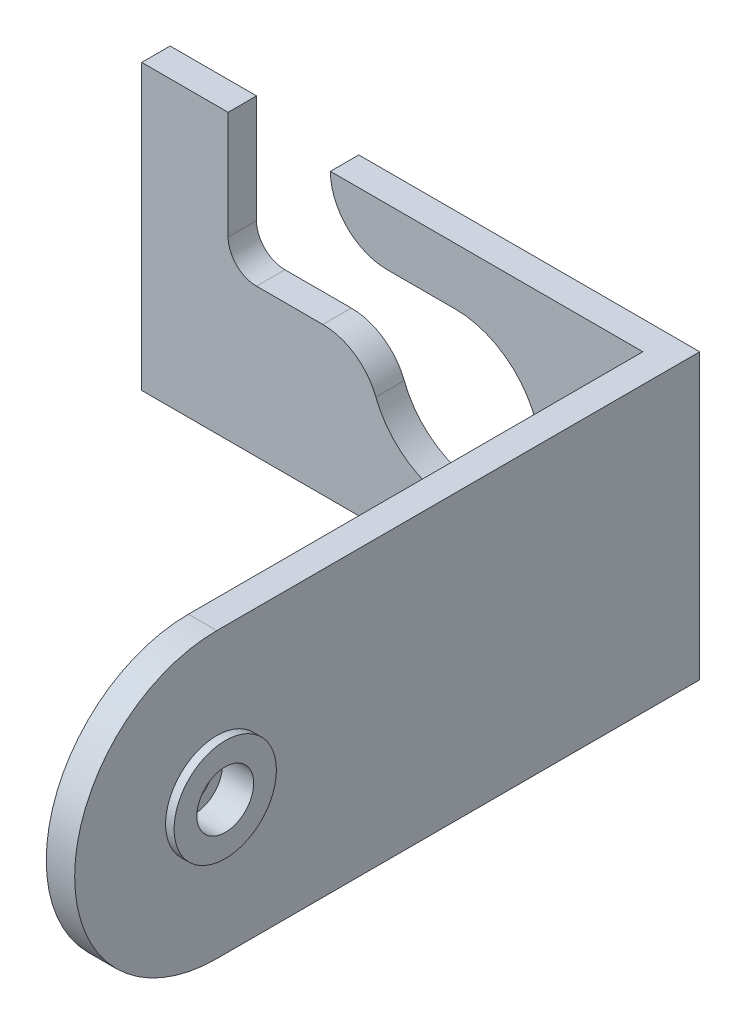
ISO-10303-21;
HEADER;
FILE_DESCRIPTION(('STEP AP214'),'2;1');
FILE_NAME('part.step','',(''),(''),'','','');
FILE_SCHEMA(('AUTOMOTIVE_DESIGN { 1 0 10303 214 1 1 1 1 }'));
ENDSEC;
DATA;
#1=APPLICATION_CONTEXT('core data for automotive mechanical design processes');
#2=APPLICATION_PROTOCOL_DEFINITION('international standard','automotive_design',2000,#1);
#3=PRODUCT_CONTEXT('',#1,'mechanical');
#4=PRODUCT('Part','Part','',(#3));
#5=PRODUCT_RELATED_PRODUCT_CATEGORY('part','',(#4));
#6=PRODUCT_DEFINITION_FORMATION('','',#4);
#7=PRODUCT_DEFINITION_CONTEXT('part definition',#1,'design');
#8=PRODUCT_DEFINITION('design','',#6,#7);
#9=PRODUCT_DEFINITION_SHAPE('','',#8);
#10=(LENGTH_UNIT() NAMED_UNIT(*) SI_UNIT(.MILLI.,.METRE.));
#11=(NAMED_UNIT(*) PLANE_ANGLE_UNIT() SI_UNIT($,.RADIAN.));
#12=(NAMED_UNIT(*) SI_UNIT($,.STERADIAN.) SOLID_ANGLE_UNIT());
#13=UNCERTAINTY_MEASURE_WITH_UNIT(LENGTH_MEASURE(1.E-05),#10,'distance_accuracy_value','');
#14=(GEOMETRIC_REPRESENTATION_CONTEXT(3) GLOBAL_UNCERTAINTY_ASSIGNED_CONTEXT((#13)) GLOBAL_UNIT_ASSIGNED_CONTEXT((#10,
#11,#12)) REPRESENTATION_CONTEXT('',''));
#15=CARTESIAN_POINT('',(0.,0.,0.));
#16=DIRECTION('',(0.,0.,1.));
#17=DIRECTION('',(1.,0.,0.));
#18=AXIS2_PLACEMENT_3D('',#15,#16,#17);
#19=CARTESIAN_POINT('',(2.5,12.5,0.));
#20=DIRECTION('',(0.,1.,0.));
#21=DIRECTION('',(0.,0.,1.));
#22=AXIS2_PLACEMENT_3D('',#19,#20,#21);
#23=PLANE('',#22);
#24=DIRECTION('',(0.,0.,1.));
#25=VECTOR('',#24,1.);
#26=CARTESIAN_POINT('',(-27.4999999999519,12.5,-42.501));
#27=LINE('',#26,#25);
#28=CARTESIAN_POINT('',(-27.4999999999519,12.5,-42.5));
#29=VERTEX_POINT('',#28);
#30=CARTESIAN_POINT('',(-27.4999999999519,12.5,-40.));
#31=VERTEX_POINT('',#30);
#32=EDGE_CURVE('E139',#29,#31,#27,.T.);
#33=ORIENTED_EDGE('',*,*,#32,.T.);
#34=DIRECTION('',(1.,0.,0.));
#35=VECTOR('',#34,1.);
#36=CARTESIAN_POINT('',(2.5,12.5,-40.));
#37=LINE('',#36,#35);
#38=CARTESIAN_POINT('',(0.,12.5,-40.));
#39=VERTEX_POINT('',#38);
#40=EDGE_CURVE('E215',#31,#39,#37,.T.);
#41=ORIENTED_EDGE('',*,*,#40,.T.);
#42=DIRECTION('',(0.,0.,-1.));
#43=VECTOR('',#42,1.);
#44=CARTESIAN_POINT('',(0.,12.5,0.));
#45=LINE('',#44,#43);
#46=CARTESIAN_POINT('',(0.,12.5,0.));
#47=VERTEX_POINT('',#46);
#48=EDGE_CURVE('E201',#47,#39,#45,.T.);
#49=ORIENTED_EDGE('',*,*,#48,.F.);
#50=DIRECTION('',(-1.,0.,0.));
#51=VECTOR('',#50,1.);
#52=CARTESIAN_POINT('',(2.5,12.5,0.));
#53=LINE('',#52,#51);
#54=CARTESIAN_POINT('',(2.5,12.5,0.));
#55=VERTEX_POINT('',#54);
#56=EDGE_CURVE('E167',#55,#47,#53,.T.);
#57=ORIENTED_EDGE('',*,*,#56,.F.);
#58=DIRECTION('',(0.,0.,-1.));
#59=VECTOR('',#58,1.);
#60=CARTESIAN_POINT('',(2.5,12.5,0.));
#61=LINE('',#60,#59);
#62=CARTESIAN_POINT('',(2.5,12.5,-42.5));
#63=VERTEX_POINT('',#62);
#64=EDGE_CURVE('E162',#55,#63,#61,.T.);
#65=ORIENTED_EDGE('',*,*,#64,.T.);
#66=DIRECTION('',(-1.,0.,0.));
#67=VECTOR('',#66,1.);
#68=CARTESIAN_POINT('',(2.5,12.5,-42.5));
#69=LINE('',#68,#67);
#70=EDGE_CURVE('E156',#63,#29,#69,.T.);
#71=ORIENTED_EDGE('',*,*,#70,.T.);
#72=EDGE_LOOP('',(#33,#41,#49,#57,#65,#71));
#73=FACE_BOUND('',#72,.T.);
#74=ADVANCED_FACE('F39',(#73),#23,.T.);
#75=CARTESIAN_POINT('',(0.,0.,0.));
#76=DIRECTION('',(1.,0.,0.));
#77=DIRECTION('',(0.,0.,-1.));
#78=AXIS2_PLACEMENT_3D('',#75,#76,#77);
#79=PLANE('',#78);
#80=CARTESIAN_POINT('',(0.,0.,0.));
#81=DIRECTION('',(1.,0.,0.));
#82=DIRECTION('',(0.,0.,-1.));
#83=AXIS2_PLACEMENT_3D('',#80,#81,#82);
#84=CIRCLE('',#83,4.5);
#85=CARTESIAN_POINT('',(0.,0.,-4.5));
#86=VERTEX_POINT('',#85);
#87=EDGE_CURVE('E173',#86,#86,#84,.T.);
#88=ORIENTED_EDGE('',*,*,#87,.T.);
#89=EDGE_LOOP('',(#88));
#90=FACE_BOUND('',#89,.T.);
#91=DIRECTION('',(0.,1.,0.));
#92=VECTOR('',#91,1.);
#93=CARTESIAN_POINT('',(0.,0.,-40.));
#94=LINE('',#93,#92);
#95=CARTESIAN_POINT('',(0.,-12.5,-40.));
#96=VERTEX_POINT('',#95);
#97=EDGE_CURVE('E12',#96,#39,#94,.T.);
#98=ORIENTED_EDGE('',*,*,#97,.F.);
#99=DIRECTION('',(0.,0.,-1.));
#100=VECTOR('',#99,1.);
#101=CARTESIAN_POINT('',(0.,-12.5,0.));
#102=LINE('',#101,#100);
#103=CARTESIAN_POINT('',(0.,-12.5,0.));
#104=VERTEX_POINT('',#103);
#105=EDGE_CURVE('E208',#104,#96,#102,.T.);
#106=ORIENTED_EDGE('',*,*,#105,.F.);
#107=CARTESIAN_POINT('',(0.,0.,0.));
#108=DIRECTION('',(1.,0.,0.));
#109=DIRECTION('',(0.,0.,-1.));
#110=AXIS2_PLACEMENT_3D('',#107,#108,#109);
#111=CIRCLE('',#110,12.5);
#112=EDGE_CURVE('E175',#47,#104,#111,.T.);
#113=ORIENTED_EDGE('',*,*,#112,.F.);
#114=ORIENTED_EDGE('',*,*,#48,.T.);
#115=EDGE_LOOP('',(#98,#106,#113,#114));
#116=FACE_BOUND('',#115,.T.);
#117=ADVANCED_FACE('F211',(#90,#116),#79,.F.);
#118=CARTESIAN_POINT('',(2.5,0.,0.));
#119=DIRECTION('',(1.,0.,0.));
#120=DIRECTION('',(0.,0.,-1.));
#121=AXIS2_PLACEMENT_3D('',#118,#119,#120);
#122=PLANE('',#121);
#123=DIRECTION('',(0.,-1.,0.));
#124=VECTOR('',#123,1.);
#125=CARTESIAN_POINT('',(2.5,0.,-42.5));
#126=LINE('',#125,#124);
#127=CARTESIAN_POINT('',(2.5,-12.5,-42.5));
#128=VERTEX_POINT('',#127);
#129=EDGE_CURVE('E203',#63,#128,#126,.T.);
#130=ORIENTED_EDGE('',*,*,#129,.F.);
#131=ORIENTED_EDGE('',*,*,#64,.F.);
#132=CARTESIAN_POINT('',(2.5,0.,0.));
#133=DIRECTION('',(1.,0.,0.));
#134=DIRECTION('',(0.,0.,-1.));
#135=AXIS2_PLACEMENT_3D('',#132,#133,#134);
#136=CIRCLE('',#135,12.5);
#137=CARTESIAN_POINT('',(2.5,-12.5,0.));
#138=VERTEX_POINT('',#137);
#139=EDGE_CURVE('E197',#55,#138,#136,.T.);
#140=ORIENTED_EDGE('',*,*,#139,.T.);
#141=DIRECTION('',(0.,0.,-1.));
#142=VECTOR('',#141,1.);
#143=CARTESIAN_POINT('',(2.5,-12.5,0.));
#144=LINE('',#143,#142);
#145=EDGE_CURVE('E200',#138,#128,#144,.T.);
#146=ORIENTED_EDGE('',*,*,#145,.T.);
#147=EDGE_LOOP('',(#130,#131,#140,#146));
#148=FACE_BOUND('',#147,.T.);
#149=CARTESIAN_POINT('',(2.5,0.,0.));
#150=DIRECTION('',(1.,0.,0.));
#151=DIRECTION('',(0.,0.,-1.));
#152=AXIS2_PLACEMENT_3D('',#149,#150,#151);
#153=CIRCLE('',#152,4.5);
#154=CARTESIAN_POINT('',(2.5,0.,-4.5));
#155=VERTEX_POINT('',#154);
#156=EDGE_CURVE('E191',#155,#155,#153,.T.);
#157=ORIENTED_EDGE('',*,*,#156,.F.);
#158=EDGE_LOOP('',(#157));
#159=FACE_BOUND('',#158,.T.);
#160=ADVANCED_FACE('F249',(#148,#159),#122,.T.);
#161=CARTESIAN_POINT('',(2.5,0.,0.));
#162=DIRECTION('',(-1.,0.,0.));
#163=DIRECTION('',(0.,0.,1.));
#164=AXIS2_PLACEMENT_3D('',#161,#162,#163);
#165=CYLINDRICAL_SURFACE('',#164,1.5);
#166=CARTESIAN_POINT('',(-1.8,0.,0.));
#167=DIRECTION('',(-1.,0.,0.));
#168=DIRECTION('',(0.,0.,1.));
#169=AXIS2_PLACEMENT_3D('',#166,#167,#168);
#170=CIRCLE('',#169,1.5);
#171=CARTESIAN_POINT('',(-1.8,0.,1.5));
#172=VERTEX_POINT('',#171);
#173=EDGE_CURVE('E179',#172,#172,#170,.T.);
#174=ORIENTED_EDGE('',*,*,#173,.T.);
#175=EDGE_LOOP('',(#174));
#176=FACE_BOUND('',#175,.T.);
#177=CARTESIAN_POINT('',(0.5,0.,0.));
#178=DIRECTION('',(1.,0.,0.));
#179=DIRECTION('',(0.,0.,-1.));
#180=AXIS2_PLACEMENT_3D('',#177,#178,#179);
#181=CIRCLE('',#180,1.5);
#182=CARTESIAN_POINT('',(0.5,0.,-1.5));
#183=VERTEX_POINT('',#182);
#184=EDGE_CURVE('E177',#183,#183,#181,.T.);
#185=ORIENTED_EDGE('',*,*,#184,.T.);
#186=EDGE_LOOP('',(#185));
#187=FACE_BOUND('',#186,.T.);
#188=ADVANCED_FACE('F251',(#176,#187),#165,.F.);
#189=CARTESIAN_POINT('',(2.5,0.,0.));
#190=DIRECTION('',(-1.,0.,0.));
#191=DIRECTION('',(0.,0.,1.));
#192=AXIS2_PLACEMENT_3D('',#189,#190,#191);
#193=CYLINDRICAL_SURFACE('',#192,12.5);
#194=ORIENTED_EDGE('',*,*,#112,.T.);
#195=DIRECTION('',(-1.,0.,0.));
#196=VECTOR('',#195,1.);
#197=CARTESIAN_POINT('',(2.5,-12.5,0.));
#198=LINE('',#197,#196);
#199=EDGE_CURVE('E47',#138,#104,#198,.T.);
#200=ORIENTED_EDGE('',*,*,#199,.F.);
#201=ORIENTED_EDGE('',*,*,#139,.F.);
#202=ORIENTED_EDGE('',*,*,#56,.T.);
#203=EDGE_LOOP('',(#194,#200,#201,#202));
#204=FACE_BOUND('',#203,.T.);
#205=ADVANCED_FACE('F41',(#204),#193,.T.);
#206=CARTESIAN_POINT('',(2.5,-12.5,0.));
#207=DIRECTION('',(0.,1.,0.));
#208=DIRECTION('',(0.,0.,1.));
#209=AXIS2_PLACEMENT_3D('',#206,#207,#208);
#210=PLANE('',#209);
#211=DIRECTION('',(-1.,0.,0.));
#212=VECTOR('',#211,1.);
#213=CARTESIAN_POINT('',(2.5,-12.5,-42.5));
#214=LINE('',#213,#212);
#215=CARTESIAN_POINT('',(-44.1,-12.5,-42.5));
#216=VERTEX_POINT('',#215);
#217=EDGE_CURVE('E163',#128,#216,#214,.T.);
#218=ORIENTED_EDGE('',*,*,#217,.F.);
#219=ORIENTED_EDGE('',*,*,#145,.F.);
#220=ORIENTED_EDGE('',*,*,#199,.T.);
#221=ORIENTED_EDGE('',*,*,#105,.T.);
#222=DIRECTION('',(-1.,0.,0.));
#223=VECTOR('',#222,1.);
#224=CARTESIAN_POINT('',(2.5,-12.5,-40.));
#225=LINE('',#224,#223);
#226=CARTESIAN_POINT('',(-44.1,-12.5,-40.));
#227=VERTEX_POINT('',#226);
#228=EDGE_CURVE('E217',#96,#227,#225,.T.);
#229=ORIENTED_EDGE('',*,*,#228,.T.);
#230=DIRECTION('',(0.,0.,-1.));
#231=VECTOR('',#230,1.);
#232=CARTESIAN_POINT('',(-44.1,-12.5,-40.));
#233=LINE('',#232,#231);
#234=EDGE_CURVE('E234',#227,#216,#233,.T.);
#235=ORIENTED_EDGE('',*,*,#234,.T.);
#236=EDGE_LOOP('',(#218,#219,#220,#221,#229,#235));
#237=FACE_BOUND('',#236,.T.);
#238=ADVANCED_FACE('F280',(#237),#210,.F.);
#239=CARTESIAN_POINT('',(2.5,0.,-42.5));
#240=DIRECTION('',(0.,0.,-1.));
#241=DIRECTION('',(-1.,0.,0.));
#242=AXIS2_PLACEMENT_3D('',#239,#240,#241);
#243=PLANE('',#242);
#244=CARTESIAN_POINT('',(-22.4999999999519,12.4999999999875,-42.5));
#245=DIRECTION('',(0.,0.,-1.));
#246=DIRECTION('',(-1.,0.,0.));
#247=AXIS2_PLACEMENT_3D('',#244,#245,#246);
#248=CIRCLE('',#247,5.);
#249=CARTESIAN_POINT('',(-22.4999999999519,7.49999999998754,-42.5));
#250=VERTEX_POINT('',#249);
#251=EDGE_CURVE('E142',#250,#29,#248,.T.);
#252=ORIENTED_EDGE('',*,*,#251,.T.);
#253=ORIENTED_EDGE('',*,*,#70,.F.);
#254=ORIENTED_EDGE('',*,*,#129,.T.);
#255=ORIENTED_EDGE('',*,*,#217,.T.);
#256=DIRECTION('',(0.,1.,0.));
#257=VECTOR('',#256,1.);
#258=CARTESIAN_POINT('',(-44.1,12.5,-42.5));
#259=LINE('',#258,#257);
#260=CARTESIAN_POINT('',(-44.1,12.5,-42.5));
#261=VERTEX_POINT('',#260);
#262=EDGE_CURVE('E224',#216,#261,#259,.T.);
#263=ORIENTED_EDGE('',*,*,#262,.T.);
#264=CARTESIAN_POINT('',(-36.4999999999519,12.5,-42.5));
#265=VERTEX_POINT('',#264);
#266=EDGE_CURVE('E164',#265,#261,#69,.T.);
#267=ORIENTED_EDGE('',*,*,#266,.F.);
#268=DIRECTION('',(0.,-1.,0.));
#269=VECTOR('',#268,1.);
#270=CARTESIAN_POINT('',(-36.4999999999519,2.99999999998945,-42.5));
#271=LINE('',#270,#269);
#272=CARTESIAN_POINT('',(-36.4999999999519,2.99999999998945,-42.5));
#273=VERTEX_POINT('',#272);
#274=EDGE_CURVE('E285',#265,#273,#271,.T.);
#275=ORIENTED_EDGE('',*,*,#274,.T.);
#276=CARTESIAN_POINT('',(-33.9999999999519,2.99999999998944,-42.5));
#277=DIRECTION('',(0.,0.,-1.));
#278=DIRECTION('',(-1.,0.,0.));
#279=AXIS2_PLACEMENT_3D('',#276,#277,#278);
#280=CIRCLE('',#279,2.5);
#281=CARTESIAN_POINT('',(-33.9999999999519,0.49999999998944,-42.5));
#282=VERTEX_POINT('',#281);
#283=EDGE_CURVE('E323',#273,#282,#280,.F.);
#284=ORIENTED_EDGE('',*,*,#283,.T.);
#285=DIRECTION('',(1.,0.,0.));
#286=VECTOR('',#285,1.);
#287=CARTESIAN_POINT('',(-28.1619037896432,0.49999999998943,-42.5));
#288=LINE('',#287,#286);
#289=CARTESIAN_POINT('',(-28.1619037896432,0.49999999998943,-42.5));
#290=VERTEX_POINT('',#289);
#291=EDGE_CURVE('E326',#282,#290,#288,.T.);
#292=ORIENTED_EDGE('',*,*,#291,.T.);
#293=CARTESIAN_POINT('',(-28.1619037896432,-4.50000000001057,-42.5));
#294=DIRECTION('',(0.,0.,-1.));
#295=DIRECTION('',(-1.,0.,0.));
#296=AXIS2_PLACEMENT_3D('',#293,#294,#295);
#297=CIRCLE('',#296,5.);
#298=CARTESIAN_POINT('',(-23.4971422737667,-2.70000000001133,-42.5));
#299=VERTEX_POINT('',#298);
#300=EDGE_CURVE('E331',#290,#299,#297,.T.);
#301=ORIENTED_EDGE('',*,*,#300,.T.);
#302=CARTESIAN_POINT('',(-16.4999999999519,-1.24761312392252E-11,-42.5));
#303=DIRECTION('',(0.,0.,-1.));
#304=DIRECTION('',(-1.,0.,0.));
#305=AXIS2_PLACEMENT_3D('',#302,#303,#304);
#306=CIRCLE('',#305,7.5);
#307=CARTESIAN_POINT('',(-16.4999999999519,7.49999999998752,-42.5));
#308=VERTEX_POINT('',#307);
#309=EDGE_CURVE('E334',#299,#308,#306,.F.);
#310=ORIENTED_EDGE('',*,*,#309,.T.);
#311=DIRECTION('',(-1.,0.,0.));
#312=VECTOR('',#311,1.);
#313=CARTESIAN_POINT('',(-22.4999999999519,7.49999999998754,-42.5));
#314=LINE('',#313,#312);
#315=EDGE_CURVE('E159',#308,#250,#314,.T.);
#316=ORIENTED_EDGE('',*,*,#315,.T.);
#317=EDGE_LOOP('',(#252,#253,#254,#255,#263,#267,#275,#284,#292,#301,#310,#316));
#318=FACE_BOUND('',#317,.T.);
#319=ADVANCED_FACE('F154',(#318),#243,.T.);
#320=DIRECTION('',(0.,0.,1.));
#321=VECTOR('',#320,1.);
#322=CARTESIAN_POINT('',(-36.4999999999519,12.5,-42.501));
#323=LINE('',#322,#321);
#324=CARTESIAN_POINT('',(-36.4999999999519,12.5,-40.));
#325=VERTEX_POINT('',#324);
#326=EDGE_CURVE('E54',#265,#325,#323,.T.);
#327=ORIENTED_EDGE('',*,*,#326,.F.);
#328=ORIENTED_EDGE('',*,*,#266,.T.);
#329=DIRECTION('',(0.,0.,-1.));
#330=VECTOR('',#329,1.);
#331=CARTESIAN_POINT('',(-44.1,12.5,-40.));
#332=LINE('',#331,#330);
#333=CARTESIAN_POINT('',(-44.1,12.5,-40.));
#334=VERTEX_POINT('',#333);
#335=EDGE_CURVE('E236',#334,#261,#332,.T.);
#336=ORIENTED_EDGE('',*,*,#335,.F.);
#337=EDGE_CURVE('E232',#334,#325,#37,.T.);
#338=ORIENTED_EDGE('',*,*,#337,.T.);
#339=EDGE_LOOP('',(#327,#328,#336,#338));
#340=FACE_BOUND('',#339,.T.);
#341=ADVANCED_FACE('F265',(#340),#23,.T.);
#342=CARTESIAN_POINT('',(15.2279220613579,0.,0.));
#343=DIRECTION('',(-1.,0.,0.));
#344=DIRECTION('',(0.,0.,1.));
#345=AXIS2_PLACEMENT_3D('',#342,#343,#344);
#346=CYLINDRICAL_SURFACE('',#345,4.5);
#347=CARTESIAN_POINT('',(-1.8,0.,0.));
#348=DIRECTION('',(-1.,0.,0.));
#349=DIRECTION('',(0.,0.,1.));
#350=AXIS2_PLACEMENT_3D('',#347,#348,#349);
#351=CIRCLE('',#350,4.5);
#352=CARTESIAN_POINT('',(-1.8,0.,4.5));
#353=VERTEX_POINT('',#352);
#354=EDGE_CURVE('E176',#353,#353,#351,.T.);
#355=ORIENTED_EDGE('',*,*,#354,.F.);
#356=EDGE_LOOP('',(#355));
#357=FACE_BOUND('',#356,.T.);
#358=ORIENTED_EDGE('',*,*,#87,.F.);
#359=EDGE_LOOP('',(#358));
#360=FACE_BOUND('',#359,.T.);
#361=ADVANCED_FACE('F272',(#357,#360),#346,.T.);
#362=CARTESIAN_POINT('',(-1.8,0.,0.));
#363=DIRECTION('',(-1.,0.,0.));
#364=DIRECTION('',(0.,0.,1.));
#365=AXIS2_PLACEMENT_3D('',#362,#363,#364);
#366=PLANE('',#365);
#367=ORIENTED_EDGE('',*,*,#354,.T.);
#368=EDGE_LOOP('',(#367));
#369=FACE_BOUND('',#368,.T.);
#370=ORIENTED_EDGE('',*,*,#173,.F.);
#371=EDGE_LOOP('',(#370));
#372=FACE_BOUND('',#371,.T.);
#373=ADVANCED_FACE('F278',(#369,#372),#366,.T.);
#374=CARTESIAN_POINT('',(0.5,0.,0.));
#375=DIRECTION('',(1.,0.,0.));
#376=DIRECTION('',(0.,0.,-1.));
#377=AXIS2_PLACEMENT_3D('',#374,#375,#376);
#378=CYLINDRICAL_SURFACE('',#377,2.5);
#379=CARTESIAN_POINT('',(0.5,0.,0.));
#380=DIRECTION('',(1.,0.,0.));
#381=DIRECTION('',(0.,0.,-1.));
#382=AXIS2_PLACEMENT_3D('',#379,#380,#381);
#383=CIRCLE('',#382,2.5);
#384=CARTESIAN_POINT('',(0.5,0.,-2.5));
#385=VERTEX_POINT('',#384);
#386=EDGE_CURVE('E180',#385,#385,#383,.T.);
#387=ORIENTED_EDGE('',*,*,#386,.F.);
#388=EDGE_LOOP('',(#387));
#389=FACE_BOUND('',#388,.T.);
#390=CARTESIAN_POINT('',(3.25,0.,0.));
#391=DIRECTION('',(1.,0.,0.));
#392=DIRECTION('',(0.,0.,-1.));
#393=AXIS2_PLACEMENT_3D('',#390,#391,#392);
#394=CIRCLE('',#393,2.5);
#395=CARTESIAN_POINT('',(3.25,0.,-2.5));
#396=VERTEX_POINT('',#395);
#397=EDGE_CURVE('E239',#396,#396,#394,.T.);
#398=ORIENTED_EDGE('',*,*,#397,.T.);
#399=EDGE_LOOP('',(#398));
#400=FACE_BOUND('',#399,.T.);
#401=ADVANCED_FACE('F380',(#389,#400),#378,.F.);
#402=CARTESIAN_POINT('',(0.5,0.,0.));
#403=DIRECTION('',(1.,0.,0.));
#404=DIRECTION('',(0.,0.,-1.));
#405=AXIS2_PLACEMENT_3D('',#402,#403,#404);
#406=PLANE('',#405);
#407=ORIENTED_EDGE('',*,*,#184,.F.);
#408=EDGE_LOOP('',(#407));
#409=FACE_BOUND('',#408,.T.);
#410=ORIENTED_EDGE('',*,*,#386,.T.);
#411=EDGE_LOOP('',(#410));
#412=FACE_BOUND('',#411,.T.);
#413=ADVANCED_FACE('F373',(#409,#412),#406,.T.);
#414=CARTESIAN_POINT('',(3.25,0.,0.));
#415=DIRECTION('',(1.,0.,0.));
#416=DIRECTION('',(0.,0.,-1.));
#417=AXIS2_PLACEMENT_3D('',#414,#415,#416);
#418=PLANE('',#417);
#419=CARTESIAN_POINT('',(3.25,0.,0.));
#420=DIRECTION('',(1.,0.,0.));
#421=DIRECTION('',(0.,0.,-1.));
#422=AXIS2_PLACEMENT_3D('',#419,#420,#421);
#423=CIRCLE('',#422,4.5);
#424=CARTESIAN_POINT('',(3.25,0.,-4.5));
#425=VERTEX_POINT('',#424);
#426=EDGE_CURVE('E186',#425,#425,#423,.T.);
#427=ORIENTED_EDGE('',*,*,#426,.T.);
#428=EDGE_LOOP('',(#427));
#429=FACE_BOUND('',#428,.T.);
#430=ORIENTED_EDGE('',*,*,#397,.F.);
#431=EDGE_LOOP('',(#430));
#432=FACE_BOUND('',#431,.T.);
#433=ADVANCED_FACE('F370',(#429,#432),#418,.T.);
#434=CARTESIAN_POINT('',(3.25,0.,0.));
#435=DIRECTION('',(-1.,0.,0.));
#436=DIRECTION('',(0.,0.,1.));
#437=AXIS2_PLACEMENT_3D('',#434,#435,#436);
#438=CYLINDRICAL_SURFACE('',#437,4.5);
#439=ORIENTED_EDGE('',*,*,#426,.F.);
#440=EDGE_LOOP('',(#439));
#441=FACE_BOUND('',#440,.T.);
#442=ORIENTED_EDGE('',*,*,#156,.T.);
#443=EDGE_LOOP('',(#442));
#444=FACE_BOUND('',#443,.T.);
#445=ADVANCED_FACE('F247',(#441,#444),#438,.T.);
#446=CARTESIAN_POINT('',(0.,0.,-40.));
#447=DIRECTION('',(0.,0.,-1.));
#448=DIRECTION('',(-1.,0.,0.));
#449=AXIS2_PLACEMENT_3D('',#446,#447,#448);
#450=PLANE('',#449);
#451=ORIENTED_EDGE('',*,*,#40,.F.);
#452=CARTESIAN_POINT('',(-22.4999999999519,12.4999999999875,-40.));
#453=DIRECTION('',(0.,0.,-1.));
#454=DIRECTION('',(1.,0.,0.));
#455=AXIS2_PLACEMENT_3D('',#452,#453,#454);
#456=CIRCLE('',#455,5.);
#457=CARTESIAN_POINT('',(-22.4999999999519,7.49999999998754,-40.));
#458=VERTEX_POINT('',#457);
#459=EDGE_CURVE('E145',#458,#31,#456,.T.);
#460=ORIENTED_EDGE('',*,*,#459,.F.);
#461=DIRECTION('',(-1.,0.,0.));
#462=VECTOR('',#461,1.);
#463=CARTESIAN_POINT('',(-22.4999999999519,7.49999999998754,-40.));
#464=LINE('',#463,#462);
#465=CARTESIAN_POINT('',(-16.4999999999519,7.49999999998752,-40.));
#466=VERTEX_POINT('',#465);
#467=EDGE_CURVE('E149',#466,#458,#464,.T.);
#468=ORIENTED_EDGE('',*,*,#467,.F.);
#469=CARTESIAN_POINT('',(-16.4999999999519,-1.24761312392252E-11,-40.));
#470=DIRECTION('',(0.,0.,1.));
#471=DIRECTION('',(1.,0.,0.));
#472=AXIS2_PLACEMENT_3D('',#469,#470,#471);
#473=CIRCLE('',#472,7.5);
#474=CARTESIAN_POINT('',(-23.4971422737667,-2.70000000001133,-40.));
#475=VERTEX_POINT('',#474);
#476=EDGE_CURVE('E306',#475,#466,#473,.T.);
#477=ORIENTED_EDGE('',*,*,#476,.F.);
#478=CARTESIAN_POINT('',(-28.1619037896432,-4.50000000001057,-40.));
#479=DIRECTION('',(0.,0.,-1.));
#480=DIRECTION('',(1.,0.,0.));
#481=AXIS2_PLACEMENT_3D('',#478,#479,#480);
#482=CIRCLE('',#481,5.);
#483=CARTESIAN_POINT('',(-28.1619037896432,0.499999999989431,-40.));
#484=VERTEX_POINT('',#483);
#485=EDGE_CURVE('E303',#484,#475,#482,.T.);
#486=ORIENTED_EDGE('',*,*,#485,.F.);
#487=DIRECTION('',(1.,0.,0.));
#488=VECTOR('',#487,1.);
#489=CARTESIAN_POINT('',(-28.1619037896432,0.49999999998943,-40.));
#490=LINE('',#489,#488);
#491=CARTESIAN_POINT('',(-33.9999999999519,0.499999999989442,-40.));
#492=VERTEX_POINT('',#491);
#493=EDGE_CURVE('E297',#492,#484,#490,.T.);
#494=ORIENTED_EDGE('',*,*,#493,.F.);
#495=CARTESIAN_POINT('',(-33.9999999999519,2.99999999998944,-40.));
#496=DIRECTION('',(0.,0.,1.));
#497=DIRECTION('',(1.,0.,0.));
#498=AXIS2_PLACEMENT_3D('',#495,#496,#497);
#499=CIRCLE('',#498,2.5);
#500=CARTESIAN_POINT('',(-36.4999999999519,2.99999999998945,-40.));
#501=VERTEX_POINT('',#500);
#502=EDGE_CURVE('E294',#501,#492,#499,.T.);
#503=ORIENTED_EDGE('',*,*,#502,.F.);
#504=DIRECTION('',(0.,-1.,0.));
#505=VECTOR('',#504,1.);
#506=CARTESIAN_POINT('',(-36.4999999999519,2.99999999998945,-40.));
#507=LINE('',#506,#505);
#508=EDGE_CURVE('E291',#325,#501,#507,.T.);
#509=ORIENTED_EDGE('',*,*,#508,.F.);
#510=ORIENTED_EDGE('',*,*,#337,.F.);
#511=DIRECTION('',(0.,1.,0.));
#512=VECTOR('',#511,1.);
#513=CARTESIAN_POINT('',(-44.1,12.5,-40.));
#514=LINE('',#513,#512);
#515=EDGE_CURVE('E220',#227,#334,#514,.T.);
#516=ORIENTED_EDGE('',*,*,#515,.F.);
#517=ORIENTED_EDGE('',*,*,#228,.F.);
#518=ORIENTED_EDGE('',*,*,#97,.T.);
#519=EDGE_LOOP('',(#451,#460,#468,#477,#486,#494,#503,#509,#510,#516,#517,#518));
#520=FACE_BOUND('',#519,.T.);
#521=ADVANCED_FACE('F214',(#520),#450,.F.);
#522=CARTESIAN_POINT('',(-44.1,12.5,-40.));
#523=DIRECTION('',(-1.,0.,0.));
#524=DIRECTION('',(0.,0.,1.));
#525=AXIS2_PLACEMENT_3D('',#522,#523,#524);
#526=PLANE('',#525);
#527=ORIENTED_EDGE('',*,*,#262,.F.);
#528=ORIENTED_EDGE('',*,*,#234,.F.);
#529=ORIENTED_EDGE('',*,*,#515,.T.);
#530=ORIENTED_EDGE('',*,*,#335,.T.);
#531=EDGE_LOOP('',(#527,#528,#529,#530));
#532=FACE_BOUND('',#531,.T.);
#533=ADVANCED_FACE('F289',(#532),#526,.T.);
#534=CARTESIAN_POINT('',(-22.4999999999519,12.4999999999875,-42.501));
#535=DIRECTION('',(0.,0.,1.));
#536=DIRECTION('',(1.,0.,0.));
#537=AXIS2_PLACEMENT_3D('',#534,#535,#536);
#538=CYLINDRICAL_SURFACE('',#537,5.);
#539=DIRECTION('',(0.,0.,1.));
#540=VECTOR('',#539,1.);
#541=CARTESIAN_POINT('',(-22.4999999999519,7.49999999998754,-42.501));
#542=LINE('',#541,#540);
#543=EDGE_CURVE('E228',#250,#458,#542,.T.);
#544=ORIENTED_EDGE('',*,*,#543,.T.);
#545=ORIENTED_EDGE('',*,*,#459,.T.);
#546=ORIENTED_EDGE('',*,*,#32,.F.);
#547=ORIENTED_EDGE('',*,*,#251,.F.);
#548=EDGE_LOOP('',(#544,#545,#546,#547));
#549=FACE_BOUND('',#548,.T.);
#550=ADVANCED_FACE('F141',(#549),#538,.T.);
#551=CARTESIAN_POINT('',(-22.4999999999519,7.49999999998754,-42.501));
#552=DIRECTION('',(0.,1.,0.));
#553=DIRECTION('',(-1.,0.,0.));
#554=AXIS2_PLACEMENT_3D('',#551,#552,#553);
#555=PLANE('',#554);
#556=DIRECTION('',(0.,0.,1.));
#557=VECTOR('',#556,1.);
#558=CARTESIAN_POINT('',(-16.4999999999519,7.49999999998752,-42.501));
#559=LINE('',#558,#557);
#560=EDGE_CURVE('E312',#308,#466,#559,.T.);
#561=ORIENTED_EDGE('',*,*,#560,.T.);
#562=ORIENTED_EDGE('',*,*,#467,.T.);
#563=ORIENTED_EDGE('',*,*,#543,.F.);
#564=ORIENTED_EDGE('',*,*,#315,.F.);
#565=EDGE_LOOP('',(#561,#562,#563,#564));
#566=FACE_BOUND('',#565,.T.);
#567=ADVANCED_FACE('F347',(#566),#555,.F.);
#568=CARTESIAN_POINT('',(-16.4999999999519,-1.24761312392252E-11,-42.501));
#569=DIRECTION('',(0.,0.,1.));
#570=DIRECTION('',(1.,0.,0.));
#571=AXIS2_PLACEMENT_3D('',#568,#569,#570);
#572=CYLINDRICAL_SURFACE('',#571,7.5);
#573=DIRECTION('',(0.,0.,1.));
#574=VECTOR('',#573,1.);
#575=CARTESIAN_POINT('',(-23.4971422737667,-2.70000000001133,-42.501));
#576=LINE('',#575,#574);
#577=EDGE_CURVE('E314',#299,#475,#576,.T.);
#578=ORIENTED_EDGE('',*,*,#577,.T.);
#579=ORIENTED_EDGE('',*,*,#476,.T.);
#580=ORIENTED_EDGE('',*,*,#560,.F.);
#581=ORIENTED_EDGE('',*,*,#309,.F.);
#582=EDGE_LOOP('',(#578,#579,#580,#581));
#583=FACE_BOUND('',#582,.T.);
#584=ADVANCED_FACE('F339',(#583),#572,.F.);
#585=CARTESIAN_POINT('',(-28.1619037896432,-4.50000000001057,-42.501));
#586=DIRECTION('',(0.,0.,1.));
#587=DIRECTION('',(1.,0.,0.));
#588=AXIS2_PLACEMENT_3D('',#585,#586,#587);
#589=CYLINDRICAL_SURFACE('',#588,5.);
#590=DIRECTION('',(0.,0.,1.));
#591=VECTOR('',#590,1.);
#592=CARTESIAN_POINT('',(-28.1619037896432,0.499999999989431,-42.501));
#593=LINE('',#592,#591);
#594=EDGE_CURVE('E316',#290,#484,#593,.T.);
#595=ORIENTED_EDGE('',*,*,#594,.T.);
#596=ORIENTED_EDGE('',*,*,#485,.T.);
#597=ORIENTED_EDGE('',*,*,#577,.F.);
#598=ORIENTED_EDGE('',*,*,#300,.F.);
#599=EDGE_LOOP('',(#595,#596,#597,#598));
#600=FACE_BOUND('',#599,.T.);
#601=ADVANCED_FACE('F341',(#600),#589,.T.);
#602=CARTESIAN_POINT('',(-28.1619037896432,0.49999999998943,-42.501));
#603=DIRECTION('',(0.,-1.,0.));
#604=DIRECTION('',(1.,0.,0.));
#605=AXIS2_PLACEMENT_3D('',#602,#603,#604);
#606=PLANE('',#605);
#607=DIRECTION('',(0.,0.,1.));
#608=VECTOR('',#607,1.);
#609=CARTESIAN_POINT('',(-33.9999999999519,0.499999999989442,-42.501));
#610=LINE('',#609,#608);
#611=EDGE_CURVE('E318',#282,#492,#610,.T.);
#612=ORIENTED_EDGE('',*,*,#611,.T.);
#613=ORIENTED_EDGE('',*,*,#493,.T.);
#614=ORIENTED_EDGE('',*,*,#594,.F.);
#615=ORIENTED_EDGE('',*,*,#291,.F.);
#616=EDGE_LOOP('',(#612,#613,#614,#615));
#617=FACE_BOUND('',#616,.T.);
#618=ADVANCED_FACE('F359',(#617),#606,.F.);
#619=CARTESIAN_POINT('',(-33.9999999999519,2.99999999998944,-42.501));
#620=DIRECTION('',(0.,0.,1.));
#621=DIRECTION('',(1.,0.,0.));
#622=AXIS2_PLACEMENT_3D('',#619,#620,#621);
#623=CYLINDRICAL_SURFACE('',#622,2.5);
#624=DIRECTION('',(0.,0.,1.));
#625=VECTOR('',#624,1.);
#626=CARTESIAN_POINT('',(-36.4999999999519,2.99999999998945,-42.501));
#627=LINE('',#626,#625);
#628=EDGE_CURVE('E282',#273,#501,#627,.T.);
#629=ORIENTED_EDGE('',*,*,#628,.T.);
#630=ORIENTED_EDGE('',*,*,#502,.T.);
#631=ORIENTED_EDGE('',*,*,#611,.F.);
#632=ORIENTED_EDGE('',*,*,#283,.F.);
#633=EDGE_LOOP('',(#629,#630,#631,#632));
#634=FACE_BOUND('',#633,.T.);
#635=ADVANCED_FACE('F321',(#634),#623,.F.);
#636=CARTESIAN_POINT('',(-36.4999999999519,2.99999999998945,-42.501));
#637=DIRECTION('',(-1.,0.,0.));
#638=DIRECTION('',(0.,-1.,0.));
#639=AXIS2_PLACEMENT_3D('',#636,#637,#638);
#640=PLANE('',#639);
#641=ORIENTED_EDGE('',*,*,#326,.T.);
#642=ORIENTED_EDGE('',*,*,#508,.T.);
#643=ORIENTED_EDGE('',*,*,#628,.F.);
#644=ORIENTED_EDGE('',*,*,#274,.F.);
#645=EDGE_LOOP('',(#641,#642,#643,#644));
#646=FACE_BOUND('',#645,.T.);
#647=ADVANCED_FACE('F324',(#646),#640,.F.);
#648=CLOSED_SHELL('',(#74,#117,#160,#188,#205,#238,#319,#341,#361,#373,#401,#413,#433,#445,#521,
#533,#550,#567,#584,#601,#618,#635,#647));
#649=MANIFOLD_SOLID_BREP('B2',#648);
#650=ADVANCED_BREP_SHAPE_REPRESENTATION('',(#18,#649),#14);
#651=SHAPE_DEFINITION_REPRESENTATION(#9,#650);
ENDSEC;
END-ISO-10303-21;
